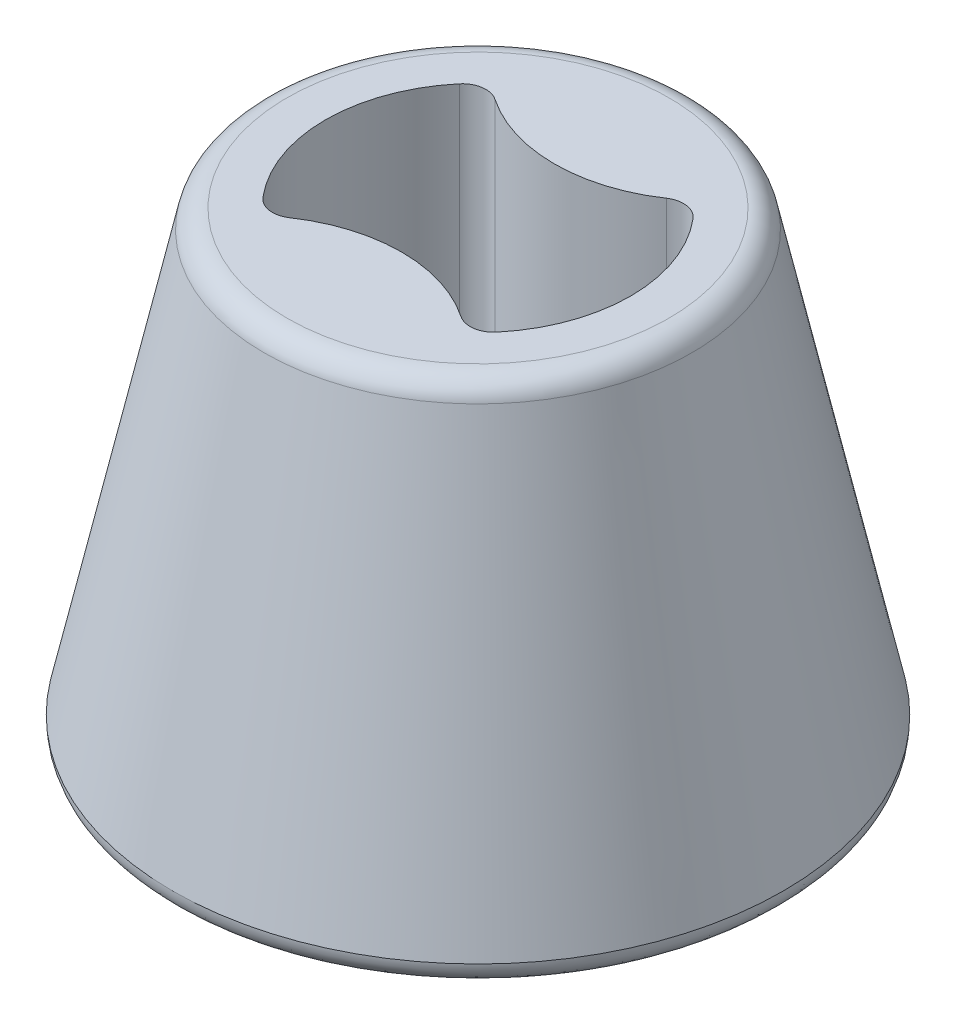
ISO-10303-21;
HEADER;
FILE_DESCRIPTION(('STEP AP214'),'2;1');
FILE_NAME('part.step','',(''),(''),'','','');
FILE_SCHEMA(('AUTOMOTIVE_DESIGN { 1 0 10303 214 1 1 1 1 }'));
ENDSEC;
DATA;
#1=APPLICATION_CONTEXT('core data for automotive mechanical design processes');
#2=APPLICATION_PROTOCOL_DEFINITION('international standard','automotive_design',2000,#1);
#3=PRODUCT_CONTEXT('',#1,'mechanical');
#4=PRODUCT('Part','Part','',(#3));
#5=PRODUCT_RELATED_PRODUCT_CATEGORY('part','',(#4));
#6=PRODUCT_DEFINITION_FORMATION('','',#4);
#7=PRODUCT_DEFINITION_CONTEXT('part definition',#1,'design');
#8=PRODUCT_DEFINITION('design','',#6,#7);
#9=PRODUCT_DEFINITION_SHAPE('','',#8);
#10=(LENGTH_UNIT() NAMED_UNIT(*) SI_UNIT(.MILLI.,.METRE.));
#11=(NAMED_UNIT(*) PLANE_ANGLE_UNIT() SI_UNIT($,.RADIAN.));
#12=(NAMED_UNIT(*) SI_UNIT($,.STERADIAN.) SOLID_ANGLE_UNIT());
#13=UNCERTAINTY_MEASURE_WITH_UNIT(LENGTH_MEASURE(1.E-05),#10,'distance_accuracy_value','');
#14=(GEOMETRIC_REPRESENTATION_CONTEXT(3) GLOBAL_UNCERTAINTY_ASSIGNED_CONTEXT((#13)) GLOBAL_UNIT_ASSIGNED_CONTEXT((#10,
#11,#12)) REPRESENTATION_CONTEXT('',''));
#15=CARTESIAN_POINT('',(0.,0.,0.));
#16=DIRECTION('',(0.,0.,1.));
#17=DIRECTION('',(1.,0.,0.));
#18=AXIS2_PLACEMENT_3D('',#15,#16,#17);
#19=CARTESIAN_POINT('',(0.,18.6875000000003,0.));
#20=DIRECTION('',(0.,1.,0.));
#21=DIRECTION('',(0.,0.,1.));
#22=AXIS2_PLACEMENT_3D('',#19,#20,#21);
#23=PLANE('',#22);
#24=CARTESIAN_POINT('',(0.,18.6875000000003,0.));
#25=DIRECTION('',(0.,1.,0.));
#26=DIRECTION('',(0.,0.,1.));
#27=AXIS2_PLACEMENT_3D('',#24,#25,#26);
#28=CIRCLE('',#27,8.13153458296175);
#29=CARTESIAN_POINT('',(0.,18.6875000000003,8.13153458296168));
#30=VERTEX_POINT('',#29);
#31=EDGE_CURVE('E13',#30,#30,#28,.T.);
#32=ORIENTED_EDGE('',*,*,#31,.T.);
#33=EDGE_LOOP('',(#32));
#34=FACE_BOUND('',#33,.T.);
#35=CARTESIAN_POINT('',(-4.20792077185657,18.6875000000003,3.54166666666659));
#36=DIRECTION('',(0.,1.,0.));
#37=DIRECTION('',(0.,0.,1.));
#38=AXIS2_PLACEMENT_3D('',#35,#36,#37);
#39=CIRCLE('',#38,1.);
#40=CARTESIAN_POINT('',(-4.97299727583053,18.6874999999997,4.18560606060598));
#41=VERTEX_POINT('',#40);
#42=CARTESIAN_POINT('',(-3.64686466894239,18.6874999999997,4.36944444444439));
#43=VERTEX_POINT('',#42);
#44=EDGE_CURVE('E69',#41,#43,#39,.T.);
#45=ORIENTED_EDGE('',*,*,#44,.F.);
#46=CARTESIAN_POINT('',(0.,18.6875000000003,0.));
#47=DIRECTION('',(0.,1.,0.));
#48=DIRECTION('',(0.,0.,1.));
#49=AXIS2_PLACEMENT_3D('',#46,#47,#48);
#50=CIRCLE('',#49,6.5);
#51=CARTESIAN_POINT('',(-4.97299727583048,18.6875000000001,-4.18560606060621));
#52=VERTEX_POINT('',#51);
#53=EDGE_CURVE('E140',#52,#41,#50,.T.);
#54=ORIENTED_EDGE('',*,*,#53,.F.);
#55=CARTESIAN_POINT('',(-4.20792077185653,18.6875,-3.54166666666674));
#56=DIRECTION('',(0.,1.,0.));
#57=DIRECTION('',(0.,0.,1.));
#58=AXIS2_PLACEMENT_3D('',#55,#56,#57);
#59=CIRCLE('',#58,1.);
#60=CARTESIAN_POINT('',(-3.64686466894236,18.6875,-4.3694444444445));
#61=VERTEX_POINT('',#60);
#62=EDGE_CURVE('E143',#61,#52,#59,.T.);
#63=ORIENTED_EDGE('',*,*,#62,.F.);
#64=CARTESIAN_POINT('',(0.,18.6875000000002,-9.75000000000013));
#65=DIRECTION('',(0.,-1.,0.));
#66=DIRECTION('',(0.,0.,1.));
#67=AXIS2_PLACEMENT_3D('',#64,#65,#66);
#68=CIRCLE('',#67,6.5);
#69=CARTESIAN_POINT('',(3.6468646689424,18.6875000000002,-4.36944444444456));
#70=VERTEX_POINT('',#69);
#71=EDGE_CURVE('E171',#70,#61,#68,.T.);
#72=ORIENTED_EDGE('',*,*,#71,.F.);
#73=CARTESIAN_POINT('',(4.20792077185658,18.6874999999999,-3.54166666666676));
#74=DIRECTION('',(0.,1.,0.));
#75=DIRECTION('',(0.,0.,-1.));
#76=AXIS2_PLACEMENT_3D('',#73,#74,#75);
#77=CIRCLE('',#76,1.);
#78=CARTESIAN_POINT('',(4.97299727583052,18.6875000000003,-4.18560606060613));
#79=VERTEX_POINT('',#78);
#80=EDGE_CURVE('E168',#79,#70,#77,.T.);
#81=ORIENTED_EDGE('',*,*,#80,.F.);
#82=CARTESIAN_POINT('',(0.,18.6875000000003,0.));
#83=DIRECTION('',(0.,1.,0.));
#84=DIRECTION('',(0.,0.,1.));
#85=AXIS2_PLACEMENT_3D('',#82,#83,#84);
#86=CIRCLE('',#85,6.5);
#87=CARTESIAN_POINT('',(4.97299727583054,18.6874999999999,4.18560606060601));
#88=VERTEX_POINT('',#87);
#89=EDGE_CURVE('E165',#88,#79,#86,.T.);
#90=ORIENTED_EDGE('',*,*,#89,.F.);
#91=CARTESIAN_POINT('',(4.20792077185658,18.6875000000001,3.54166666666658));
#92=DIRECTION('',(0.,1.,0.));
#93=DIRECTION('',(0.,0.,-1.));
#94=AXIS2_PLACEMENT_3D('',#91,#92,#93);
#95=CIRCLE('',#94,1.);
#96=CARTESIAN_POINT('',(3.64686466894238,18.6875000000001,4.36944444444437));
#97=VERTEX_POINT('',#96);
#98=EDGE_CURVE('E162',#97,#88,#95,.T.);
#99=ORIENTED_EDGE('',*,*,#98,.F.);
#100=CARTESIAN_POINT('',(0.,18.6875000000002,9.74999999999994));
#101=DIRECTION('',(0.,-1.,0.));
#102=DIRECTION('',(0.,0.,1.));
#103=AXIS2_PLACEMENT_3D('',#100,#101,#102);
#104=CIRCLE('',#103,6.5);
#105=EDGE_CURVE('E160',#43,#97,#104,.T.);
#106=ORIENTED_EDGE('',*,*,#105,.F.);
#107=EDGE_LOOP('',(#45,#54,#63,#72,#81,#90,#99,#106));
#108=FACE_BOUND('',#107,.T.);
#109=ADVANCED_FACE('F54',(#34,#108),#23,.T.);
#110=CARTESIAN_POINT('',(0.,0.,0.));
#111=DIRECTION('',(0.,-1.,0.));
#112=DIRECTION('',(0.,0.,-1.));
#113=AXIS2_PLACEMENT_3D('',#110,#111,#112);
#114=CONICAL_SURFACE('',#113,13.,0.214060683563822);
#115=CARTESIAN_POINT('',(0.,17.8999296443313,0.));
#116=DIRECTION('',(0.,1.,0.));
#117=DIRECTION('',(0.,0.,1.));
#118=AXIS2_PLACEMENT_3D('',#115,#116,#117);
#119=CIRCLE('',#118,9.10871094688456);
#120=CARTESIAN_POINT('',(0.,17.8999296443313,9.10871094688452));
#121=VERTEX_POINT('',#120);
#122=EDGE_CURVE('E62',#121,#121,#119,.F.);
#123=ORIENTED_EDGE('',*,*,#122,.T.);
#124=EDGE_LOOP('',(#123));
#125=FACE_BOUND('',#124,.T.);
#126=CARTESIAN_POINT('',(0.,0.,0.));
#127=DIRECTION('',(0.,-1.,0.));
#128=DIRECTION('',(0.,0.,-1.));
#129=AXIS2_PLACEMENT_3D('',#126,#127,#128);
#130=CIRCLE('',#129,13.);
#131=CARTESIAN_POINT('',(0.,0.,-13.));
#132=VERTEX_POINT('',#131);
#133=EDGE_CURVE('E285',#132,#132,#130,.T.);
#134=ORIENTED_EDGE('',*,*,#133,.F.);
#135=EDGE_LOOP('',(#134));
#136=FACE_BOUND('',#135,.T.);
#137=ADVANCED_FACE('F207',(#125,#136),#114,.T.);
#138=CARTESIAN_POINT('',(7.31356993919887,-1.49858092918698,0.));
#139=CARTESIAN_POINT('',(6.90961922696514,-1.51766743454784,0.));
#140=CARTESIAN_POINT('',(6.09639540092306,-1.55117893658374,0.));
#141=CARTESIAN_POINT('',(5.28360734937837,-1.57554825749173,0.));
#142=CARTESIAN_POINT('',(4.87480913999475,-1.5857415607694,0.));
#143=B_SPLINE_CURVE_WITH_KNOTS('',3,(#138,#139,#140,#141,#142),.UNSPECIFIED.,.F.,.F.,(4,1,4),
(0.460546637112765,0.549936438959364,0.640414928210702),.UNSPECIFIED.);
#144=CARTESIAN_POINT('',(0.,0.,0.));
#145=DIRECTION('',(0.,1.,0.));
#146=AXIS1_PLACEMENT('',#144,#145);
#147=SURFACE_OF_REVOLUTION('',#143,#146);
#148=CARTESIAN_POINT('',(0.,-1.58574156076974,0.));
#149=DIRECTION('',(0.,1.,0.));
#150=DIRECTION('',(0.,0.,1.));
#151=AXIS2_PLACEMENT_3D('',#148,#149,#150);
#152=CIRCLE('',#151,4.87480913999476);
#153=CARTESIAN_POINT('',(0.,-1.58574156076974,4.87480913999472));
#154=VERTEX_POINT('',#153);
#155=EDGE_CURVE('E178',#154,#154,#152,.T.);
#156=ORIENTED_EDGE('',*,*,#155,.T.);
#157=EDGE_LOOP('',(#156));
#158=FACE_BOUND('',#157,.T.);
#159=CARTESIAN_POINT('',(0.,-1.49858092918675,0.));
#160=DIRECTION('',(0.,1.,0.));
#161=DIRECTION('',(0.,0.,1.));
#162=AXIS2_PLACEMENT_3D('',#159,#160,#161);
#163=CIRCLE('',#162,7.31356993919889);
#164=CARTESIAN_POINT('',(0.,-1.49858092918676,7.31356993919884));
#165=VERTEX_POINT('',#164);
#166=EDGE_CURVE('E282',#165,#165,#163,.T.);
#167=ORIENTED_EDGE('',*,*,#166,.F.);
#168=EDGE_LOOP('',(#167));
#169=FACE_BOUND('',#168,.T.);
#170=ADVANCED_FACE('F202',(#158,#169),#147,.F.);
#171=CARTESIAN_POINT('',(0.,-1.45344339730791,0.));
#172=DIRECTION('',(0.,1.,0.));
#173=DIRECTION('',(0.,0.,1.));
#174=AXIS2_PLACEMENT_3D('',#171,#172,#173);
#175=TOROIDAL_SURFACE('',#174,8.12480781140712,0.812492635098359);
#176=CARTESIAN_POINT('',(0.,-1.40830586542873,-1.17961196366423E-13));
#177=DIRECTION('',(0.,1.,0.));
#178=DIRECTION('',(0.,0.,1.));
#179=AXIS2_PLACEMENT_3D('',#176,#177,#178);
#180=CIRCLE('',#179,8.93604568361535);
#181=CARTESIAN_POINT('',(0.,-1.40830586542873,8.93604568361525));
#182=VERTEX_POINT('',#181);
#183=EDGE_CURVE('E279',#182,#182,#180,.T.);
#184=ORIENTED_EDGE('',*,*,#183,.F.);
#185=EDGE_LOOP('',(#184));
#186=FACE_BOUND('',#185,.T.);
#187=ORIENTED_EDGE('',*,*,#166,.T.);
#188=EDGE_LOOP('',(#187));
#189=FACE_BOUND('',#188,.T.);
#190=ADVANCED_FACE('F206',(#186,#189),#175,.T.);
#191=CARTESIAN_POINT('',(13.,3.33066907387547E-13,0.));
#192=CARTESIAN_POINT('',(13.004512037092,-0.704734775258786,0.));
#193=CARTESIAN_POINT('',(11.7834108432712,-1.18484795584051,-1.11022302462516E-13));
#194=CARTESIAN_POINT('',(10.2576425315465,-1.31824411196613,-1.31838984174237E-13));
#195=CARTESIAN_POINT('',(9.22936233179974,-1.38943441827488,0.));
#196=CARTESIAN_POINT('',(8.93604568361536,-1.40830586542906,0.));
#197=B_SPLINE_CURVE_WITH_KNOTS('',3,(#191,#192,#193,#194,#195,#196),.UNSPECIFIED.,.F.,.F.,(4,1,
1,4),(0.,0.112318716124181,0.275650600803335,0.3407338124801),.UNSPECIFIED.);
#198=CARTESIAN_POINT('',(0.,0.,0.));
#199=DIRECTION('',(0.,1.,0.));
#200=AXIS1_PLACEMENT('',#198,#199);
#201=SURFACE_OF_REVOLUTION('',#197,#200);
#202=ORIENTED_EDGE('',*,*,#183,.T.);
#203=EDGE_LOOP('',(#202));
#204=FACE_BOUND('',#203,.T.);
#205=ORIENTED_EDGE('',*,*,#133,.T.);
#206=EDGE_LOOP('',(#205));
#207=FACE_BOUND('',#206,.T.);
#208=ADVANCED_FACE('F266',(#204,#207),#201,.F.);
#209=CARTESIAN_POINT('',(3.25009782653389,-1.61595940819392,0.));
#210=CARTESIAN_POINT('',(1.62573456548329,-1.63645244554866,-1.59594559789866E-13));
#211=CARTESIAN_POINT('',(0.,-1.62499999999965,0.));
#212=B_SPLINE_CURVE_WITH_KNOTS('',2,(#209,#210,#211),.UNSPECIFIED.,.F.,.F.,(3,3),
(0.760291847603477,1.),.UNSPECIFIED.);
#213=CARTESIAN_POINT('',(0.,0.,0.));
#214=DIRECTION('',(0.,1.,0.));
#215=AXIS1_PLACEMENT('',#213,#214);
#216=SURFACE_OF_REVOLUTION('',#212,#215);
#217=CARTESIAN_POINT('',(0.,-1.62499999999965,0.));
#218=VERTEX_POINT('',#217);
#219=VERTEX_LOOP('',#218);
#220=FACE_BOUND('',#219,.T.);
#221=CARTESIAN_POINT('',(0.,-1.61595940819426,0.));
#222=DIRECTION('',(0.,1.,0.));
#223=DIRECTION('',(0.,0.,1.));
#224=AXIS2_PLACEMENT_3D('',#221,#222,#223);
#225=CIRCLE('',#224,3.25009782653386);
#226=CARTESIAN_POINT('',(0.,-1.61595940819426,3.25009782653383));
#227=VERTEX_POINT('',#226);
#228=EDGE_CURVE('E276',#227,#227,#225,.T.);
#229=ORIENTED_EDGE('',*,*,#228,.F.);
#230=EDGE_LOOP('',(#229));
#231=FACE_BOUND('',#230,.T.);
#232=ADVANCED_FACE('F263',(#220,#231),#216,.F.);
#233=CARTESIAN_POINT('',(0.,-1.60085048448166,0.));
#234=DIRECTION('',(0.,1.,0.));
#235=DIRECTION('',(0.,0.,1.));
#236=AXIS2_PLACEMENT_3D('',#233,#234,#235);
#237=TOROIDAL_SURFACE('',#236,4.06245348326431,0.812496149281771);
#238=ORIENTED_EDGE('',*,*,#155,.F.);
#239=EDGE_LOOP('',(#238));
#240=FACE_BOUND('',#239,.T.);
#241=ORIENTED_EDGE('',*,*,#228,.T.);
#242=EDGE_LOOP('',(#241));
#243=FACE_BOUND('',#242,.T.);
#244=ADVANCED_FACE('F260',(#240,#243),#237,.T.);
#245=CARTESIAN_POINT('',(-4.20792077185657,8.68750000000029,3.5416666666666));
#246=DIRECTION('',(0.,1.,0.));
#247=DIRECTION('',(0.,0.,1.));
#248=AXIS2_PLACEMENT_3D('',#245,#246,#247);
#249=CYLINDRICAL_SURFACE('',#248,1.);
#250=ORIENTED_EDGE('',*,*,#44,.T.);
#251=DIRECTION('',(0.,1.,0.));
#252=VECTOR('',#251,1.);
#253=CARTESIAN_POINT('',(-3.64686466894238,8.68750000000007,4.36944444444442));
#254=LINE('',#253,#252);
#255=CARTESIAN_POINT('',(-3.64686466894238,8.68750000000007,4.36944444444442));
#256=VERTEX_POINT('',#255);
#257=EDGE_CURVE('E117',#256,#43,#254,.T.);
#258=ORIENTED_EDGE('',*,*,#257,.F.);
#259=CARTESIAN_POINT('',(-4.20792077185657,8.68750000000029,3.5416666666666));
#260=DIRECTION('',(0.,1.,0.));
#261=DIRECTION('',(0.,0.,1.));
#262=AXIS2_PLACEMENT_3D('',#259,#260,#261);
#263=CIRCLE('',#262,1.);
#264=CARTESIAN_POINT('',(-4.97299727583053,8.68750000000007,4.18560606060604));
#265=VERTEX_POINT('',#264);
#266=EDGE_CURVE('E121',#265,#256,#263,.T.);
#267=ORIENTED_EDGE('',*,*,#266,.F.);
#268=DIRECTION('',(0.,1.,0.));
#269=VECTOR('',#268,1.);
#270=CARTESIAN_POINT('',(-4.97299727583053,8.68750000000007,4.18560606060604));
#271=LINE('',#270,#269);
#272=EDGE_CURVE('E176',#265,#41,#271,.T.);
#273=ORIENTED_EDGE('',*,*,#272,.T.);
#274=EDGE_LOOP('',(#250,#258,#267,#273));
#275=FACE_BOUND('',#274,.T.);
#276=ADVANCED_FACE('F119',(#275),#249,.F.);
#277=CARTESIAN_POINT('',(0.,8.68750000000007,0.));
#278=DIRECTION('',(0.,1.,0.));
#279=DIRECTION('',(0.,0.,1.));
#280=AXIS2_PLACEMENT_3D('',#277,#278,#279);
#281=CYLINDRICAL_SURFACE('',#280,6.5);
#282=ORIENTED_EDGE('',*,*,#53,.T.);
#283=ORIENTED_EDGE('',*,*,#272,.F.);
#284=CARTESIAN_POINT('',(0.,8.68750000000007,0.));
#285=DIRECTION('',(0.,1.,0.));
#286=DIRECTION('',(0.,0.,1.));
#287=AXIS2_PLACEMENT_3D('',#284,#285,#286);
#288=CIRCLE('',#287,6.5);
#289=CARTESIAN_POINT('',(-4.97299727583055,8.68750000000018,-4.18560606060617));
#290=VERTEX_POINT('',#289);
#291=EDGE_CURVE('E127',#290,#265,#288,.T.);
#292=ORIENTED_EDGE('',*,*,#291,.F.);
#293=DIRECTION('',(0.,1.,0.));
#294=VECTOR('',#293,1.);
#295=CARTESIAN_POINT('',(-4.97299727583055,8.68750000000018,-4.18560606060617));
#296=LINE('',#295,#294);
#297=EDGE_CURVE('E179',#290,#52,#296,.T.);
#298=ORIENTED_EDGE('',*,*,#297,.T.);
#299=EDGE_LOOP('',(#282,#283,#292,#298));
#300=FACE_BOUND('',#299,.T.);
#301=ADVANCED_FACE('F238',(#300),#281,.F.);
#302=CARTESIAN_POINT('',(-4.2079207718566,8.68750000000018,-3.54166666666673));
#303=DIRECTION('',(0.,1.,0.));
#304=DIRECTION('',(0.,0.,1.));
#305=AXIS2_PLACEMENT_3D('',#302,#303,#304);
#306=CYLINDRICAL_SURFACE('',#305,1.);
#307=ORIENTED_EDGE('',*,*,#62,.T.);
#308=ORIENTED_EDGE('',*,*,#297,.F.);
#309=CARTESIAN_POINT('',(-4.2079207718566,8.68750000000018,-3.54166666666673));
#310=DIRECTION('',(0.,1.,0.));
#311=DIRECTION('',(0.,0.,1.));
#312=AXIS2_PLACEMENT_3D('',#309,#310,#311);
#313=CIRCLE('',#312,1.);
#314=CARTESIAN_POINT('',(-3.6468646689424,8.68749999999985,-4.36944444444457));
#315=VERTEX_POINT('',#314);
#316=EDGE_CURVE('E156',#315,#290,#313,.T.);
#317=ORIENTED_EDGE('',*,*,#316,.F.);
#318=DIRECTION('',(0.,1.,0.));
#319=VECTOR('',#318,1.);
#320=CARTESIAN_POINT('',(-3.6468646689424,8.68749999999985,-4.36944444444457));
#321=LINE('',#320,#319);
#322=EDGE_CURVE('E181',#315,#61,#321,.T.);
#323=ORIENTED_EDGE('',*,*,#322,.T.);
#324=EDGE_LOOP('',(#307,#308,#317,#323));
#325=FACE_BOUND('',#324,.T.);
#326=ADVANCED_FACE('F239',(#325),#306,.F.);
#327=CARTESIAN_POINT('',(0.,8.6875000000004,-9.75000000000004));
#328=DIRECTION('',(0.,1.,0.));
#329=DIRECTION('',(0.,0.,1.));
#330=AXIS2_PLACEMENT_3D('',#327,#328,#329);
#331=CYLINDRICAL_SURFACE('',#330,6.5);
#332=ORIENTED_EDGE('',*,*,#71,.T.);
#333=ORIENTED_EDGE('',*,*,#322,.F.);
#334=CARTESIAN_POINT('',(0.,8.6875000000004,-9.75000000000004));
#335=DIRECTION('',(0.,-1.,0.));
#336=DIRECTION('',(0.,0.,1.));
#337=AXIS2_PLACEMENT_3D('',#334,#335,#336);
#338=CIRCLE('',#337,6.5);
#339=CARTESIAN_POINT('',(3.64686466894237,8.68750000000018,-4.36944444444451));
#340=VERTEX_POINT('',#339);
#341=EDGE_CURVE('E153',#340,#315,#338,.T.);
#342=ORIENTED_EDGE('',*,*,#341,.F.);
#343=DIRECTION('',(0.,1.,0.));
#344=VECTOR('',#343,1.);
#345=CARTESIAN_POINT('',(3.64686466894237,8.68750000000018,-4.36944444444451));
#346=LINE('',#345,#344);
#347=EDGE_CURVE('E183',#340,#70,#346,.T.);
#348=ORIENTED_EDGE('',*,*,#347,.T.);
#349=EDGE_LOOP('',(#332,#333,#342,#348));
#350=FACE_BOUND('',#349,.T.);
#351=ADVANCED_FACE('F234',(#350),#331,.T.);
#352=CARTESIAN_POINT('',(4.20792077185659,8.68750000000029,-3.54166666666669));
#353=DIRECTION('',(0.,1.,0.));
#354=DIRECTION('',(0.,0.,1.));
#355=AXIS2_PLACEMENT_3D('',#352,#353,#354);
#356=CYLINDRICAL_SURFACE('',#355,1.);
#357=ORIENTED_EDGE('',*,*,#80,.T.);
#358=ORIENTED_EDGE('',*,*,#347,.F.);
#359=CARTESIAN_POINT('',(4.20792077185659,8.68750000000029,-3.54166666666669));
#360=DIRECTION('',(0.,1.,0.));
#361=DIRECTION('',(0.,0.,-1.));
#362=AXIS2_PLACEMENT_3D('',#359,#360,#361);
#363=CIRCLE('',#362,1.);
#364=CARTESIAN_POINT('',(4.9729972758305,8.6875000000004,-4.18560606060613));
#365=VERTEX_POINT('',#364);
#366=EDGE_CURVE('E150',#365,#340,#363,.T.);
#367=ORIENTED_EDGE('',*,*,#366,.F.);
#368=DIRECTION('',(0.,1.,0.));
#369=VECTOR('',#368,1.);
#370=CARTESIAN_POINT('',(4.9729972758305,8.6875000000004,-4.18560606060613));
#371=LINE('',#370,#369);
#372=EDGE_CURVE('E185',#365,#79,#371,.T.);
#373=ORIENTED_EDGE('',*,*,#372,.T.);
#374=EDGE_LOOP('',(#357,#358,#367,#373));
#375=FACE_BOUND('',#374,.T.);
#376=ADVANCED_FACE('F230',(#375),#356,.F.);
#377=CARTESIAN_POINT('',(0.,8.68750000000007,0.));
#378=DIRECTION('',(0.,1.,0.));
#379=DIRECTION('',(0.,0.,1.));
#380=AXIS2_PLACEMENT_3D('',#377,#378,#379);
#381=CYLINDRICAL_SURFACE('',#380,6.5);
#382=ORIENTED_EDGE('',*,*,#89,.T.);
#383=ORIENTED_EDGE('',*,*,#372,.F.);
#384=CARTESIAN_POINT('',(0.,8.68750000000007,0.));
#385=DIRECTION('',(0.,1.,0.));
#386=DIRECTION('',(0.,0.,1.));
#387=AXIS2_PLACEMENT_3D('',#384,#385,#386);
#388=CIRCLE('',#387,6.5);
#389=CARTESIAN_POINT('',(4.97299727583051,8.68749999999996,4.18560606060595));
#390=VERTEX_POINT('',#389);
#391=EDGE_CURVE('E147',#390,#365,#388,.T.);
#392=ORIENTED_EDGE('',*,*,#391,.F.);
#393=DIRECTION('',(0.,1.,0.));
#394=VECTOR('',#393,1.);
#395=CARTESIAN_POINT('',(4.97299727583051,8.68749999999996,4.18560606060595));
#396=LINE('',#395,#394);
#397=EDGE_CURVE('E187',#390,#88,#396,.T.);
#398=ORIENTED_EDGE('',*,*,#397,.T.);
#399=EDGE_LOOP('',(#382,#383,#392,#398));
#400=FACE_BOUND('',#399,.T.);
#401=ADVANCED_FACE('F228',(#400),#381,.F.);
#402=CARTESIAN_POINT('',(4.20792077185657,8.68750000000018,3.54166666666658));
#403=DIRECTION('',(0.,1.,0.));
#404=DIRECTION('',(0.,0.,1.));
#405=AXIS2_PLACEMENT_3D('',#402,#403,#404);
#406=CYLINDRICAL_SURFACE('',#405,1.);
#407=ORIENTED_EDGE('',*,*,#98,.T.);
#408=ORIENTED_EDGE('',*,*,#397,.F.);
#409=CARTESIAN_POINT('',(4.20792077185657,8.68750000000018,3.54166666666658));
#410=DIRECTION('',(0.,1.,0.));
#411=DIRECTION('',(0.,0.,-1.));
#412=AXIS2_PLACEMENT_3D('',#409,#410,#411);
#413=CIRCLE('',#412,1.);
#414=CARTESIAN_POINT('',(3.64686466894235,8.68750000000007,4.36944444444441));
#415=VERTEX_POINT('',#414);
#416=EDGE_CURVE('E135',#415,#390,#413,.T.);
#417=ORIENTED_EDGE('',*,*,#416,.F.);
#418=DIRECTION('',(0.,1.,0.));
#419=VECTOR('',#418,1.);
#420=CARTESIAN_POINT('',(3.64686466894235,8.68750000000007,4.36944444444441));
#421=LINE('',#420,#419);
#422=EDGE_CURVE('E126',#415,#97,#421,.T.);
#423=ORIENTED_EDGE('',*,*,#422,.T.);
#424=EDGE_LOOP('',(#407,#408,#417,#423));
#425=FACE_BOUND('',#424,.T.);
#426=ADVANCED_FACE('F224',(#425),#406,.F.);
#427=CARTESIAN_POINT('',(0.,8.68750000000007,9.7499999999999));
#428=DIRECTION('',(0.,1.,0.));
#429=DIRECTION('',(0.,0.,1.));
#430=AXIS2_PLACEMENT_3D('',#427,#428,#429);
#431=CYLINDRICAL_SURFACE('',#430,6.5);
#432=ORIENTED_EDGE('',*,*,#105,.T.);
#433=ORIENTED_EDGE('',*,*,#422,.F.);
#434=CARTESIAN_POINT('',(0.,8.68750000000007,9.7499999999999));
#435=DIRECTION('',(0.,-1.,0.));
#436=DIRECTION('',(0.,0.,1.));
#437=AXIS2_PLACEMENT_3D('',#434,#435,#436);
#438=CIRCLE('',#437,6.5);
#439=EDGE_CURVE('E130',#256,#415,#438,.T.);
#440=ORIENTED_EDGE('',*,*,#439,.F.);
#441=ORIENTED_EDGE('',*,*,#257,.T.);
#442=EDGE_LOOP('',(#432,#433,#440,#441));
#443=FACE_BOUND('',#442,.T.);
#444=ADVANCED_FACE('F131',(#443),#431,.T.);
#445=CARTESIAN_POINT('',(-2.10396038592829,8.68750000000018,6.64583333333329));
#446=DIRECTION('',(0.,1.,0.));
#447=DIRECTION('',(0.,0.,1.));
#448=AXIS2_PLACEMENT_3D('',#445,#446,#447);
#449=PLANE('',#448);
#450=ORIENTED_EDGE('',*,*,#266,.T.);
#451=ORIENTED_EDGE('',*,*,#439,.T.);
#452=ORIENTED_EDGE('',*,*,#416,.T.);
#453=ORIENTED_EDGE('',*,*,#391,.T.);
#454=ORIENTED_EDGE('',*,*,#366,.T.);
#455=ORIENTED_EDGE('',*,*,#341,.T.);
#456=ORIENTED_EDGE('',*,*,#316,.T.);
#457=ORIENTED_EDGE('',*,*,#291,.T.);
#458=EDGE_LOOP('',(#450,#451,#452,#453,#454,#455,#456,#457));
#459=FACE_BOUND('',#458,.T.);
#460=ADVANCED_FACE('F137',(#459),#449,.T.);
#461=CARTESIAN_POINT('',(0.,17.6874999999997,0.));
#462=DIRECTION('',(0.,1.,0.));
#463=DIRECTION('',(0.,0.,1.));
#464=AXIS2_PLACEMENT_3D('',#461,#462,#463);
#465=TOROIDAL_SURFACE('',#464,8.13153458296175,1.);
#466=ORIENTED_EDGE('',*,*,#31,.F.);
#467=EDGE_LOOP('',(#466));
#468=FACE_BOUND('',#467,.T.);
#469=ORIENTED_EDGE('',*,*,#122,.F.);
#470=EDGE_LOOP('',(#469));
#471=FACE_BOUND('',#470,.T.);
#472=ADVANCED_FACE('F56',(#468,#471),#465,.T.);
#473=CLOSED_SHELL('',(#109,#137,#170,#190,#208,#232,#244,#276,#301,#326,#351,#376,#401,#426,
#444,#460,#472));
#474=MANIFOLD_SOLID_BREP('B2',#473);
#475=ADVANCED_BREP_SHAPE_REPRESENTATION('',(#18,#474),#14);
#476=SHAPE_DEFINITION_REPRESENTATION(#9,#475);
ENDSEC;
END-ISO-10303-21;
